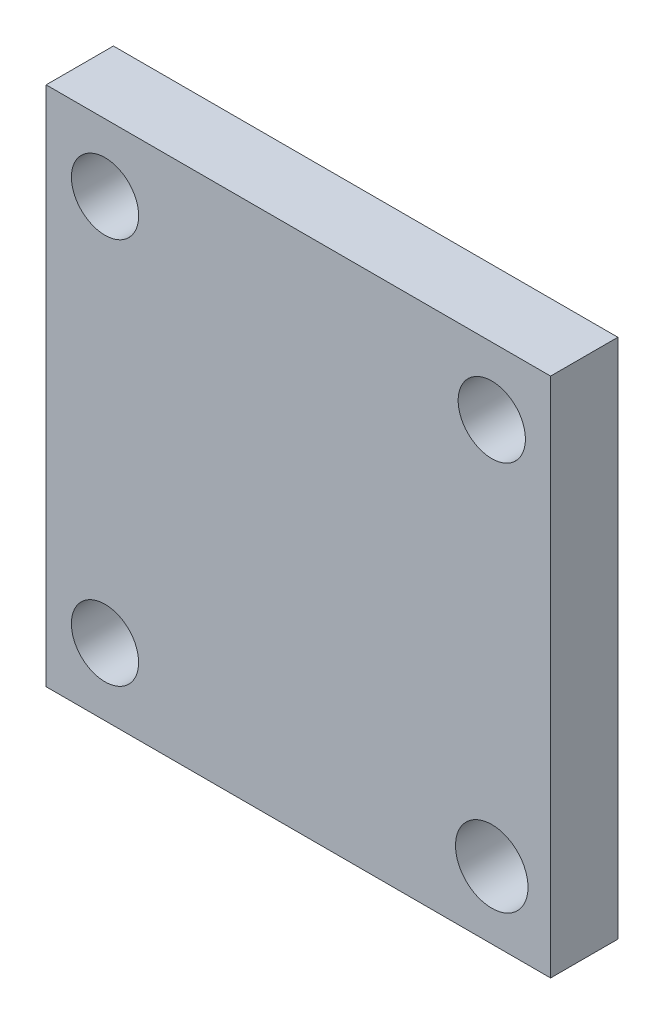
ISO-10303-21;
HEADER;
FILE_DESCRIPTION(('STEP AP214'),'2;1');
FILE_NAME('part.step','',(''),(''),'','','');
FILE_SCHEMA(('AUTOMOTIVE_DESIGN { 1 0 10303 214 1 1 1 1 }'));
ENDSEC;
DATA;
#1=APPLICATION_CONTEXT('core data for automotive mechanical design processes');
#2=APPLICATION_PROTOCOL_DEFINITION('international standard','automotive_design',2000,#1);
#3=PRODUCT_CONTEXT('',#1,'mechanical');
#4=PRODUCT('Part','Part','',(#3));
#5=PRODUCT_RELATED_PRODUCT_CATEGORY('part','',(#4));
#6=PRODUCT_DEFINITION_FORMATION('','',#4);
#7=PRODUCT_DEFINITION_CONTEXT('part definition',#1,'design');
#8=PRODUCT_DEFINITION('design','',#6,#7);
#9=PRODUCT_DEFINITION_SHAPE('','',#8);
#10=(LENGTH_UNIT() NAMED_UNIT(*) SI_UNIT(.MILLI.,.METRE.));
#11=(NAMED_UNIT(*) PLANE_ANGLE_UNIT() SI_UNIT($,.RADIAN.));
#12=(NAMED_UNIT(*) SI_UNIT($,.STERADIAN.) SOLID_ANGLE_UNIT());
#13=UNCERTAINTY_MEASURE_WITH_UNIT(LENGTH_MEASURE(1.E-05),#10,'distance_accuracy_value','');
#14=(GEOMETRIC_REPRESENTATION_CONTEXT(3) GLOBAL_UNCERTAINTY_ASSIGNED_CONTEXT((#13)) GLOBAL_UNIT_ASSIGNED_CONTEXT((#10,
#11,#12)) REPRESENTATION_CONTEXT('',''));
#15=CARTESIAN_POINT('',(0.,0.,0.));
#16=DIRECTION('',(0.,0.,1.));
#17=DIRECTION('',(1.,0.,0.));
#18=AXIS2_PLACEMENT_3D('',#15,#16,#17);
#19=CARTESIAN_POINT('',(15.001091744182,15.5010917441821,4.));
#20=DIRECTION('',(1.,0.,0.));
#21=DIRECTION('',(0.,0.,-1.));
#22=AXIS2_PLACEMENT_3D('',#19,#20,#21);
#23=PLANE('',#22);
#24=DIRECTION('',(0.,-1.,0.));
#25=VECTOR('',#24,1.);
#26=CARTESIAN_POINT('',(15.001091744182,15.5010917441821,0.));
#27=LINE('',#26,#25);
#28=CARTESIAN_POINT('',(15.001091744182,15.5010917441821,0.));
#29=VERTEX_POINT('',#28);
#30=CARTESIAN_POINT('',(15.001091744182,-15.5010917441821,0.));
#31=VERTEX_POINT('',#30);
#32=EDGE_CURVE('E101',#29,#31,#27,.T.);
#33=ORIENTED_EDGE('',*,*,#32,.F.);
#34=DIRECTION('',(0.,0.,-1.));
#35=VECTOR('',#34,1.);
#36=CARTESIAN_POINT('',(15.001091744182,15.5010917441821,4.));
#37=LINE('',#36,#35);
#38=CARTESIAN_POINT('',(15.001091744182,15.5010917441821,4.));
#39=VERTEX_POINT('',#38);
#40=EDGE_CURVE('E11',#39,#29,#37,.T.);
#41=ORIENTED_EDGE('',*,*,#40,.F.);
#42=DIRECTION('',(0.,-1.,0.));
#43=VECTOR('',#42,1.);
#44=CARTESIAN_POINT('',(15.001091744182,15.5010917441821,4.));
#45=LINE('',#44,#43);
#46=CARTESIAN_POINT('',(15.001091744182,-15.5010917441821,4.));
#47=VERTEX_POINT('',#46);
#48=EDGE_CURVE('E94',#39,#47,#45,.T.);
#49=ORIENTED_EDGE('',*,*,#48,.T.);
#50=DIRECTION('',(0.,0.,-1.));
#51=VECTOR('',#50,1.);
#52=CARTESIAN_POINT('',(15.001091744182,-15.5010917441821,4.));
#53=LINE('',#52,#51);
#54=EDGE_CURVE('E39',#47,#31,#53,.T.);
#55=ORIENTED_EDGE('',*,*,#54,.T.);
#56=EDGE_LOOP('',(#33,#41,#49,#55));
#57=FACE_BOUND('',#56,.T.);
#58=ADVANCED_FACE('F36',(#57),#23,.T.);
#59=CARTESIAN_POINT('',(-15.001091744182,15.5010917441821,4.));
#60=DIRECTION('',(0.,1.,0.));
#61=DIRECTION('',(0.,0.,1.));
#62=AXIS2_PLACEMENT_3D('',#59,#60,#61);
#63=PLANE('',#62);
#64=DIRECTION('',(1.,0.,0.));
#65=VECTOR('',#64,1.);
#66=CARTESIAN_POINT('',(-15.001091744182,15.5010917441821,0.));
#67=LINE('',#66,#65);
#68=CARTESIAN_POINT('',(-15.001091744182,15.5010917441821,0.));
#69=VERTEX_POINT('',#68);
#70=EDGE_CURVE('E96',#69,#29,#67,.T.);
#71=ORIENTED_EDGE('',*,*,#70,.F.);
#72=DIRECTION('',(0.,0.,-1.));
#73=VECTOR('',#72,1.);
#74=CARTESIAN_POINT('',(-15.001091744182,15.5010917441821,4.));
#75=LINE('',#74,#73);
#76=CARTESIAN_POINT('',(-15.001091744182,15.5010917441821,4.));
#77=VERTEX_POINT('',#76);
#78=EDGE_CURVE('E45',#77,#69,#75,.T.);
#79=ORIENTED_EDGE('',*,*,#78,.F.);
#80=DIRECTION('',(1.,0.,0.));
#81=VECTOR('',#80,1.);
#82=CARTESIAN_POINT('',(-15.001091744182,15.5010917441821,4.));
#83=LINE('',#82,#81);
#84=EDGE_CURVE('E91',#77,#39,#83,.T.);
#85=ORIENTED_EDGE('',*,*,#84,.T.);
#86=ORIENTED_EDGE('',*,*,#40,.T.);
#87=EDGE_LOOP('',(#71,#79,#85,#86));
#88=FACE_BOUND('',#87,.T.);
#89=ADVANCED_FACE('F112',(#88),#63,.T.);
#90=CARTESIAN_POINT('',(-15.001091744182,-15.5010917441821,4.));
#91=DIRECTION('',(-1.,0.,0.));
#92=DIRECTION('',(0.,0.,1.));
#93=AXIS2_PLACEMENT_3D('',#90,#91,#92);
#94=PLANE('',#93);
#95=DIRECTION('',(0.,1.,0.));
#96=VECTOR('',#95,1.);
#97=CARTESIAN_POINT('',(-15.001091744182,-15.5010917441821,0.));
#98=LINE('',#97,#96);
#99=CARTESIAN_POINT('',(-15.001091744182,-15.5010917441821,0.));
#100=VERTEX_POINT('',#99);
#101=EDGE_CURVE('E86',#100,#69,#98,.T.);
#102=ORIENTED_EDGE('',*,*,#101,.F.);
#103=DIRECTION('',(0.,0.,-1.));
#104=VECTOR('',#103,1.);
#105=CARTESIAN_POINT('',(-15.001091744182,-15.5010917441821,4.));
#106=LINE('',#105,#104);
#107=CARTESIAN_POINT('',(-15.001091744182,-15.5010917441821,4.));
#108=VERTEX_POINT('',#107);
#109=EDGE_CURVE('E81',#108,#100,#106,.T.);
#110=ORIENTED_EDGE('',*,*,#109,.F.);
#111=DIRECTION('',(0.,1.,0.));
#112=VECTOR('',#111,1.);
#113=CARTESIAN_POINT('',(-15.001091744182,-15.5010917441821,4.));
#114=LINE('',#113,#112);
#115=EDGE_CURVE('E84',#108,#77,#114,.T.);
#116=ORIENTED_EDGE('',*,*,#115,.T.);
#117=ORIENTED_EDGE('',*,*,#78,.T.);
#118=EDGE_LOOP('',(#102,#110,#116,#117));
#119=FACE_BOUND('',#118,.T.);
#120=ADVANCED_FACE('F83',(#119),#94,.T.);
#121=CARTESIAN_POINT('',(15.001091744182,-15.5010917441821,4.));
#122=DIRECTION('',(0.,-1.,0.));
#123=DIRECTION('',(1.,0.,0.));
#124=AXIS2_PLACEMENT_3D('',#121,#122,#123);
#125=PLANE('',#124);
#126=DIRECTION('',(-1.,0.,0.));
#127=VECTOR('',#126,1.);
#128=CARTESIAN_POINT('',(15.001091744182,-15.5010917441821,0.));
#129=LINE('',#128,#127);
#130=EDGE_CURVE('E104',#31,#100,#129,.T.);
#131=ORIENTED_EDGE('',*,*,#130,.F.);
#132=ORIENTED_EDGE('',*,*,#54,.F.);
#133=DIRECTION('',(-1.,0.,0.));
#134=VECTOR('',#133,1.);
#135=CARTESIAN_POINT('',(15.001091744182,-15.5010917441821,4.));
#136=LINE('',#135,#134);
#137=EDGE_CURVE('E90',#47,#108,#136,.T.);
#138=ORIENTED_EDGE('',*,*,#137,.T.);
#139=ORIENTED_EDGE('',*,*,#109,.T.);
#140=EDGE_LOOP('',(#131,#132,#138,#139));
#141=FACE_BOUND('',#140,.T.);
#142=ADVANCED_FACE('F93',(#141),#125,.T.);
#143=CARTESIAN_POINT('',(0.,0.,4.));
#144=DIRECTION('',(0.,0.,-1.));
#145=DIRECTION('',(-1.,0.,0.));
#146=AXIS2_PLACEMENT_3D('',#143,#144,#145);
#147=PLANE('',#146);
#148=CARTESIAN_POINT('',(-11.4989082558179,11.5032752325463,4.));
#149=DIRECTION('',(0.,0.,-1.));
#150=DIRECTION('',(1.,0.,0.));
#151=AXIS2_PLACEMENT_3D('',#148,#149,#150);
#152=CIRCLE('',#151,2.);
#153=CARTESIAN_POINT('',(-9.49890825581793,11.5032752325463,4.));
#154=VERTEX_POINT('',#153);
#155=EDGE_CURVE('E153',#154,#154,#152,.T.);
#156=ORIENTED_EDGE('',*,*,#155,.T.);
#157=EDGE_LOOP('',(#156));
#158=FACE_BOUND('',#157,.T.);
#159=CARTESIAN_POINT('',(11.5032752325464,11.5010917441821,4.));
#160=DIRECTION('',(0.,0.,-1.));
#161=DIRECTION('',(1.,0.,0.));
#162=AXIS2_PLACEMENT_3D('',#159,#160,#161);
#163=CIRCLE('',#162,2.);
#164=CARTESIAN_POINT('',(13.5032752325464,11.5010917441821,4.));
#165=VERTEX_POINT('',#164);
#166=EDGE_CURVE('E161',#165,#165,#163,.T.);
#167=ORIENTED_EDGE('',*,*,#166,.T.);
#168=EDGE_LOOP('',(#167));
#169=FACE_BOUND('',#168,.T.);
#170=CARTESIAN_POINT('',(-11.501091744182,-11.4989082558181,4.));
#171=DIRECTION('',(0.,0.,-1.));
#172=DIRECTION('',(1.,0.,0.));
#173=AXIS2_PLACEMENT_3D('',#170,#171,#172);
#174=CIRCLE('',#173,2.);
#175=CARTESIAN_POINT('',(-9.50109174418201,-11.4989082558181,4.));
#176=VERTEX_POINT('',#175);
#177=EDGE_CURVE('E167',#176,#176,#174,.T.);
#178=ORIENTED_EDGE('',*,*,#177,.T.);
#179=EDGE_LOOP('',(#178));
#180=FACE_BOUND('',#179,.T.);
#181=CARTESIAN_POINT('',(11.5010917441823,-11.5010917441821,4.));
#182=DIRECTION('',(0.,0.,-1.));
#183=DIRECTION('',(1.,0.,0.));
#184=AXIS2_PLACEMENT_3D('',#181,#182,#183);
#185=CIRCLE('',#184,2.15626689761665);
#186=CARTESIAN_POINT('',(13.657358641799,-11.5010917441821,4.));
#187=VERTEX_POINT('',#186);
#188=EDGE_CURVE('E105',#187,#187,#185,.T.);
#189=ORIENTED_EDGE('',*,*,#188,.T.);
#190=EDGE_LOOP('',(#189));
#191=FACE_BOUND('',#190,.T.);
#192=ORIENTED_EDGE('',*,*,#48,.F.);
#193=ORIENTED_EDGE('',*,*,#84,.F.);
#194=ORIENTED_EDGE('',*,*,#115,.F.);
#195=ORIENTED_EDGE('',*,*,#137,.F.);
#196=EDGE_LOOP('',(#192,#193,#194,#195));
#197=FACE_BOUND('',#196,.T.);
#198=ADVANCED_FACE('F89',(#158,#169,#180,#191,#197),#147,.F.);
#199=CARTESIAN_POINT('',(0.,0.,0.));
#200=DIRECTION('',(0.,0.,-1.));
#201=DIRECTION('',(-1.,0.,0.));
#202=AXIS2_PLACEMENT_3D('',#199,#200,#201);
#203=PLANE('',#202);
#204=CARTESIAN_POINT('',(-11.4989082558179,11.5032752325463,0.));
#205=DIRECTION('',(0.,0.,-1.));
#206=DIRECTION('',(1.,0.,0.));
#207=AXIS2_PLACEMENT_3D('',#204,#205,#206);
#208=CIRCLE('',#207,2.);
#209=CARTESIAN_POINT('',(-9.49890825581793,11.5032752325463,0.));
#210=VERTEX_POINT('',#209);
#211=EDGE_CURVE('E156',#210,#210,#208,.T.);
#212=ORIENTED_EDGE('',*,*,#211,.F.);
#213=EDGE_LOOP('',(#212));
#214=FACE_BOUND('',#213,.T.);
#215=CARTESIAN_POINT('',(11.5032752325464,11.5010917441821,0.));
#216=DIRECTION('',(0.,0.,-1.));
#217=DIRECTION('',(1.,0.,0.));
#218=AXIS2_PLACEMENT_3D('',#215,#216,#217);
#219=CIRCLE('',#218,2.);
#220=CARTESIAN_POINT('',(13.5032752325464,11.5010917441821,0.));
#221=VERTEX_POINT('',#220);
#222=EDGE_CURVE('E158',#221,#221,#219,.T.);
#223=ORIENTED_EDGE('',*,*,#222,.F.);
#224=EDGE_LOOP('',(#223));
#225=FACE_BOUND('',#224,.T.);
#226=CARTESIAN_POINT('',(-11.501091744182,-11.4989082558181,0.));
#227=DIRECTION('',(0.,0.,-1.));
#228=DIRECTION('',(1.,0.,0.));
#229=AXIS2_PLACEMENT_3D('',#226,#227,#228);
#230=CIRCLE('',#229,2.);
#231=CARTESIAN_POINT('',(-9.50109174418201,-11.4989082558181,0.));
#232=VERTEX_POINT('',#231);
#233=EDGE_CURVE('E164',#232,#232,#230,.T.);
#234=ORIENTED_EDGE('',*,*,#233,.F.);
#235=EDGE_LOOP('',(#234));
#236=FACE_BOUND('',#235,.T.);
#237=CARTESIAN_POINT('',(11.5010917441823,-11.5010917441821,0.));
#238=DIRECTION('',(0.,0.,-1.));
#239=DIRECTION('',(1.,0.,0.));
#240=AXIS2_PLACEMENT_3D('',#237,#238,#239);
#241=CIRCLE('',#240,2.15626689761665);
#242=CARTESIAN_POINT('',(13.657358641799,-11.5010917441821,0.));
#243=VERTEX_POINT('',#242);
#244=EDGE_CURVE('E170',#243,#243,#241,.T.);
#245=ORIENTED_EDGE('',*,*,#244,.F.);
#246=EDGE_LOOP('',(#245));
#247=FACE_BOUND('',#246,.T.);
#248=ORIENTED_EDGE('',*,*,#32,.T.);
#249=ORIENTED_EDGE('',*,*,#130,.T.);
#250=ORIENTED_EDGE('',*,*,#101,.T.);
#251=ORIENTED_EDGE('',*,*,#70,.T.);
#252=EDGE_LOOP('',(#248,#249,#250,#251));
#253=FACE_BOUND('',#252,.T.);
#254=ADVANCED_FACE('F111',(#214,#225,#236,#247,#253),#203,.T.);
#255=CARTESIAN_POINT('',(11.5010917441823,-11.5010917441821,4.));
#256=DIRECTION('',(0.,0.,-1.));
#257=DIRECTION('',(-1.,0.,0.));
#258=AXIS2_PLACEMENT_3D('',#255,#256,#257);
#259=CYLINDRICAL_SURFACE('',#258,2.15626689761665);
#260=ORIENTED_EDGE('',*,*,#188,.F.);
#261=EDGE_LOOP('',(#260));
#262=FACE_BOUND('',#261,.T.);
#263=ORIENTED_EDGE('',*,*,#244,.T.);
#264=EDGE_LOOP('',(#263));
#265=FACE_BOUND('',#264,.T.);
#266=ADVANCED_FACE('F130',(#262,#265),#259,.F.);
#267=CARTESIAN_POINT('',(-11.501091744182,-11.4989082558181,4.));
#268=DIRECTION('',(0.,0.,-1.));
#269=DIRECTION('',(-1.,0.,0.));
#270=AXIS2_PLACEMENT_3D('',#267,#268,#269);
#271=CYLINDRICAL_SURFACE('',#270,2.);
#272=ORIENTED_EDGE('',*,*,#177,.F.);
#273=EDGE_LOOP('',(#272));
#274=FACE_BOUND('',#273,.T.);
#275=ORIENTED_EDGE('',*,*,#233,.T.);
#276=EDGE_LOOP('',(#275));
#277=FACE_BOUND('',#276,.T.);
#278=ADVANCED_FACE('F137',(#274,#277),#271,.F.);
#279=CARTESIAN_POINT('',(11.5032752325464,11.5010917441821,4.));
#280=DIRECTION('',(0.,0.,-1.));
#281=DIRECTION('',(-1.,0.,0.));
#282=AXIS2_PLACEMENT_3D('',#279,#280,#281);
#283=CYLINDRICAL_SURFACE('',#282,2.);
#284=ORIENTED_EDGE('',*,*,#166,.F.);
#285=EDGE_LOOP('',(#284));
#286=FACE_BOUND('',#285,.T.);
#287=ORIENTED_EDGE('',*,*,#222,.T.);
#288=EDGE_LOOP('',(#287));
#289=FACE_BOUND('',#288,.T.);
#290=ADVANCED_FACE('F141',(#286,#289),#283,.F.);
#291=CARTESIAN_POINT('',(-11.4989082558179,11.5032752325463,4.));
#292=DIRECTION('',(0.,0.,-1.));
#293=DIRECTION('',(-1.,0.,0.));
#294=AXIS2_PLACEMENT_3D('',#291,#292,#293);
#295=CYLINDRICAL_SURFACE('',#294,2.);
#296=ORIENTED_EDGE('',*,*,#155,.F.);
#297=EDGE_LOOP('',(#296));
#298=FACE_BOUND('',#297,.T.);
#299=ORIENTED_EDGE('',*,*,#211,.T.);
#300=EDGE_LOOP('',(#299));
#301=FACE_BOUND('',#300,.T.);
#302=ADVANCED_FACE('F145',(#298,#301),#295,.F.);
#303=CLOSED_SHELL('',(#58,#89,#120,#142,#198,#254,#266,#278,#290,#302));
#304=MANIFOLD_SOLID_BREP('B2',#303);
#305=ADVANCED_BREP_SHAPE_REPRESENTATION('',(#18,#304),#14);
#306=SHAPE_DEFINITION_REPRESENTATION(#9,#305);
ENDSEC;
END-ISO-10303-21;
